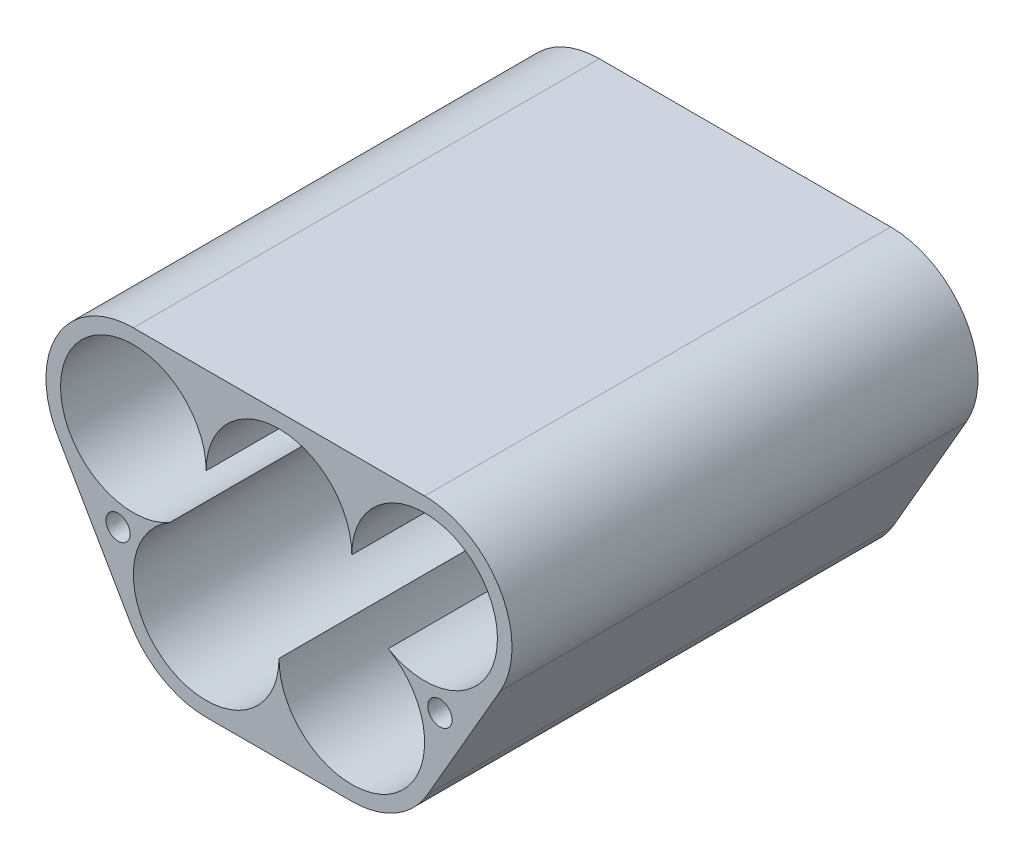
ISO-10303-21;
HEADER;
FILE_DESCRIPTION(('STEP AP214'),'2;1');
FILE_NAME('part.step','',(''),(''),'','','');
FILE_SCHEMA(('AUTOMOTIVE_DESIGN { 1 0 10303 214 1 1 1 1 }'));
ENDSEC;
DATA;
#1=APPLICATION_CONTEXT('core data for automotive mechanical design processes');
#2=APPLICATION_PROTOCOL_DEFINITION('international standard','automotive_design',2000,#1);
#3=PRODUCT_CONTEXT('',#1,'mechanical');
#4=PRODUCT('Part','Part','',(#3));
#5=PRODUCT_RELATED_PRODUCT_CATEGORY('part','',(#4));
#6=PRODUCT_DEFINITION_FORMATION('','',#4);
#7=PRODUCT_DEFINITION_CONTEXT('part definition',#1,'design');
#8=PRODUCT_DEFINITION('design','',#6,#7);
#9=PRODUCT_DEFINITION_SHAPE('','',#8);
#10=(LENGTH_UNIT() NAMED_UNIT(*) SI_UNIT(.MILLI.,.METRE.));
#11=(NAMED_UNIT(*) PLANE_ANGLE_UNIT() SI_UNIT($,.RADIAN.));
#12=(NAMED_UNIT(*) SI_UNIT($,.STERADIAN.) SOLID_ANGLE_UNIT());
#13=UNCERTAINTY_MEASURE_WITH_UNIT(LENGTH_MEASURE(1.E-05),#10,'distance_accuracy_value','');
#14=(GEOMETRIC_REPRESENTATION_CONTEXT(3) GLOBAL_UNCERTAINTY_ASSIGNED_CONTEXT((#13)) GLOBAL_UNIT_ASSIGNED_CONTEXT((#10,
#11,#12)) REPRESENTATION_CONTEXT('',''));
#15=CARTESIAN_POINT('',(0.,0.,0.));
#16=DIRECTION('',(0.,0.,1.));
#17=DIRECTION('',(1.,0.,0.));
#18=AXIS2_PLACEMENT_3D('',#15,#16,#17);
#19=CARTESIAN_POINT('',(7.5,-12.9903810567666,48.));
#20=DIRECTION('',(0.,0.,1.));
#21=DIRECTION('',(1.,0.,0.));
#22=AXIS2_PLACEMENT_3D('',#19,#20,#21);
#23=PLANE('',#22);
#24=CARTESIAN_POINT('',(31.5749810287862,-9.5701905283834,48.));
#25=DIRECTION('',(0.,0.,-1.));
#26=DIRECTION('',(-1.,0.,0.));
#27=AXIS2_PLACEMENT_3D('',#24,#25,#26);
#28=CIRCLE('',#27,1.24999999999999);
#29=CARTESIAN_POINT('',(30.3249810287862,-9.5701905283834,48.));
#30=VERTEX_POINT('',#29);
#31=EDGE_CURVE('E319',#30,#30,#28,.T.);
#32=ORIENTED_EDGE('',*,*,#31,.T.);
#33=EDGE_LOOP('',(#32));
#34=FACE_BOUND('',#33,.T.);
#35=CARTESIAN_POINT('',(-1.57605623327455,-9.5701905283834,48.));
#36=DIRECTION('',(0.,0.,-1.));
#37=DIRECTION('',(-1.,0.,0.));
#38=AXIS2_PLACEMENT_3D('',#35,#36,#37);
#39=CIRCLE('',#38,1.25);
#40=CARTESIAN_POINT('',(-2.82605623327455,-9.5701905283834,48.));
#41=VERTEX_POINT('',#40);
#42=EDGE_CURVE('E159',#41,#41,#39,.T.);
#43=ORIENTED_EDGE('',*,*,#42,.T.);
#44=EDGE_LOOP('',(#43));
#45=FACE_BOUND('',#44,.T.);
#46=CARTESIAN_POINT('',(7.5,-12.9903810567666,48.));
#47=DIRECTION('',(0.,0.,1.));
#48=DIRECTION('',(1.,0.,0.));
#49=AXIS2_PLACEMENT_3D('',#46,#47,#48);
#50=CIRCLE('',#49,9.);
#51=CARTESIAN_POINT('',(-0.294228634059947,-17.4903810567666,48.));
#52=VERTEX_POINT('',#51);
#53=CARTESIAN_POINT('',(7.4999999999999,-21.9903810567666,48.));
#54=VERTEX_POINT('',#53);
#55=EDGE_CURVE('E174',#52,#54,#50,.T.);
#56=ORIENTED_EDGE('',*,*,#55,.T.);
#57=DIRECTION('',(1.,0.,0.));
#58=VECTOR('',#57,1.);
#59=CARTESIAN_POINT('',(7.4999999999999,-21.9903810567666,48.));
#60=LINE('',#59,#58);
#61=CARTESIAN_POINT('',(22.4999999999999,-21.9903810567666,48.));
#62=VERTEX_POINT('',#61);
#63=EDGE_CURVE('E177',#54,#62,#60,.T.);
#64=ORIENTED_EDGE('',*,*,#63,.T.);
#65=CARTESIAN_POINT('',(22.5,-12.9903810567666,48.));
#66=DIRECTION('',(0.,0.,1.));
#67=DIRECTION('',(1.,0.,0.));
#68=AXIS2_PLACEMENT_3D('',#65,#66,#67);
#69=CIRCLE('',#68,9.);
#70=CARTESIAN_POINT('',(30.2942286340599,-17.4903810567666,48.));
#71=VERTEX_POINT('',#70);
#72=EDGE_CURVE('E180',#62,#71,#69,.T.);
#73=ORIENTED_EDGE('',*,*,#72,.T.);
#74=DIRECTION('',(0.5,0.866025403784438,0.));
#75=VECTOR('',#74,1.);
#76=CARTESIAN_POINT('',(30.2942286340599,-17.4903810567666,48.));
#77=LINE('',#76,#75);
#78=CARTESIAN_POINT('',(37.7942286340599,-4.5,48.));
#79=VERTEX_POINT('',#78);
#80=EDGE_CURVE('E182',#71,#79,#77,.T.);
#81=ORIENTED_EDGE('',*,*,#80,.T.);
#82=CARTESIAN_POINT('',(30.,0.,48.));
#83=DIRECTION('',(0.,0.,1.));
#84=DIRECTION('',(1.,0.,0.));
#85=AXIS2_PLACEMENT_3D('',#82,#83,#84);
#86=CIRCLE('',#85,9.00000000000001);
#87=CARTESIAN_POINT('',(30.,9.00000000000001,48.));
#88=VERTEX_POINT('',#87);
#89=EDGE_CURVE('E184',#79,#88,#86,.T.);
#90=ORIENTED_EDGE('',*,*,#89,.T.);
#91=DIRECTION('',(-1.,0.,0.));
#92=VECTOR('',#91,1.);
#93=CARTESIAN_POINT('',(30.,9.,48.));
#94=LINE('',#93,#92);
#95=CARTESIAN_POINT('',(0.,9.,48.));
#96=VERTEX_POINT('',#95);
#97=EDGE_CURVE('E186',#88,#96,#94,.T.);
#98=ORIENTED_EDGE('',*,*,#97,.T.);
#99=CARTESIAN_POINT('',(0.,0.,48.));
#100=DIRECTION('',(0.,0.,1.));
#101=DIRECTION('',(1.,0.,0.));
#102=AXIS2_PLACEMENT_3D('',#99,#100,#101);
#103=CIRCLE('',#102,9.);
#104=CARTESIAN_POINT('',(-7.79422863405995,-4.49999999999999,48.));
#105=VERTEX_POINT('',#104);
#106=EDGE_CURVE('E188',#96,#105,#103,.T.);
#107=ORIENTED_EDGE('',*,*,#106,.T.);
#108=DIRECTION('',(0.5,-0.866025403784439,0.));
#109=VECTOR('',#108,1.);
#110=CARTESIAN_POINT('',(-7.79422863405995,-4.5,48.));
#111=LINE('',#110,#109);
#112=EDGE_CURVE('E190',#105,#52,#111,.T.);
#113=ORIENTED_EDGE('',*,*,#112,.T.);
#114=EDGE_LOOP('',(#56,#64,#73,#81,#90,#98,#107,#113));
#115=FACE_BOUND('',#114,.T.);
#116=CARTESIAN_POINT('',(7.5,-12.9903810567666,48.));
#117=DIRECTION('',(0.,0.,1.));
#118=DIRECTION('',(1.,0.,0.));
#119=AXIS2_PLACEMENT_3D('',#116,#117,#118);
#120=CIRCLE('',#119,7.5);
#121=CARTESIAN_POINT('',(3.75,-6.49519052838329,48.));
#122=VERTEX_POINT('',#121);
#123=CARTESIAN_POINT('',(15.,-12.9903810567666,48.));
#124=VERTEX_POINT('',#123);
#125=EDGE_CURVE('E136',#122,#124,#120,.T.);
#126=ORIENTED_EDGE('',*,*,#125,.F.);
#127=CARTESIAN_POINT('',(0.,0.,48.));
#128=DIRECTION('',(0.,0.,1.));
#129=DIRECTION('',(1.,0.,0.));
#130=AXIS2_PLACEMENT_3D('',#127,#128,#129);
#131=CIRCLE('',#130,7.5);
#132=CARTESIAN_POINT('',(7.5,0.,48.));
#133=VERTEX_POINT('',#132);
#134=EDGE_CURVE('E128',#133,#122,#131,.T.);
#135=ORIENTED_EDGE('',*,*,#134,.F.);
#136=CARTESIAN_POINT('',(15.,0.,48.));
#137=DIRECTION('',(0.,0.,1.));
#138=DIRECTION('',(1.,0.,0.));
#139=AXIS2_PLACEMENT_3D('',#136,#137,#138);
#140=CIRCLE('',#139,7.5);
#141=CARTESIAN_POINT('',(22.5,0.,48.));
#142=VERTEX_POINT('',#141);
#143=EDGE_CURVE('E156',#142,#133,#140,.T.);
#144=ORIENTED_EDGE('',*,*,#143,.F.);
#145=CARTESIAN_POINT('',(30.,0.,48.));
#146=DIRECTION('',(0.,0.,1.));
#147=DIRECTION('',(1.,0.,0.));
#148=AXIS2_PLACEMENT_3D('',#145,#146,#147);
#149=CIRCLE('',#148,7.5);
#150=CARTESIAN_POINT('',(26.25,-6.49519052838329,48.));
#151=VERTEX_POINT('',#150);
#152=EDGE_CURVE('E151',#151,#142,#149,.T.);
#153=ORIENTED_EDGE('',*,*,#152,.F.);
#154=CARTESIAN_POINT('',(22.5,-12.9903810567666,48.));
#155=DIRECTION('',(0.,0.,1.));
#156=DIRECTION('',(1.,0.,0.));
#157=AXIS2_PLACEMENT_3D('',#154,#155,#156);
#158=CIRCLE('',#157,7.5);
#159=EDGE_CURVE('E149',#124,#151,#158,.T.);
#160=ORIENTED_EDGE('',*,*,#159,.F.);
#161=EDGE_LOOP('',(#126,#135,#144,#153,#160));
#162=FACE_BOUND('',#161,.T.);
#163=ADVANCED_FACE('F33',(#34,#45,#115,#162),#23,.T.);
#164=CARTESIAN_POINT('',(7.5,-12.9903810567666,0.));
#165=DIRECTION('',(0.,0.,1.));
#166=DIRECTION('',(1.,0.,0.));
#167=AXIS2_PLACEMENT_3D('',#164,#165,#166);
#168=PLANE('',#167);
#169=CARTESIAN_POINT('',(31.5749810287862,-9.5701905283834,0.));
#170=DIRECTION('',(0.,0.,-1.));
#171=DIRECTION('',(-1.,0.,0.));
#172=AXIS2_PLACEMENT_3D('',#169,#170,#171);
#173=CIRCLE('',#172,1.24999999999999);
#174=CARTESIAN_POINT('',(30.3249810287862,-9.5701905283834,0.));
#175=VERTEX_POINT('',#174);
#176=EDGE_CURVE('E322',#175,#175,#173,.T.);
#177=ORIENTED_EDGE('',*,*,#176,.F.);
#178=EDGE_LOOP('',(#177));
#179=FACE_BOUND('',#178,.T.);
#180=CARTESIAN_POINT('',(-1.57605623327455,-9.5701905283834,0.));
#181=DIRECTION('',(0.,0.,-1.));
#182=DIRECTION('',(-1.,0.,0.));
#183=AXIS2_PLACEMENT_3D('',#180,#181,#182);
#184=CIRCLE('',#183,1.25);
#185=CARTESIAN_POINT('',(-2.82605623327455,-9.5701905283834,0.));
#186=VERTEX_POINT('',#185);
#187=EDGE_CURVE('E324',#186,#186,#184,.T.);
#188=ORIENTED_EDGE('',*,*,#187,.F.);
#189=EDGE_LOOP('',(#188));
#190=FACE_BOUND('',#189,.T.);
#191=CARTESIAN_POINT('',(7.5,-12.9903810567666,0.));
#192=DIRECTION('',(0.,0.,1.));
#193=DIRECTION('',(1.,0.,0.));
#194=AXIS2_PLACEMENT_3D('',#191,#192,#193);
#195=CIRCLE('',#194,9.);
#196=CARTESIAN_POINT('',(-0.294228634059947,-17.4903810567666,0.));
#197=VERTEX_POINT('',#196);
#198=CARTESIAN_POINT('',(7.4999999999999,-21.9903810567666,0.));
#199=VERTEX_POINT('',#198);
#200=EDGE_CURVE('E144',#197,#199,#195,.T.);
#201=ORIENTED_EDGE('',*,*,#200,.F.);
#202=DIRECTION('',(0.5,-0.866025403784439,0.));
#203=VECTOR('',#202,1.);
#204=CARTESIAN_POINT('',(-7.79422863405995,-4.5,0.));
#205=LINE('',#204,#203);
#206=CARTESIAN_POINT('',(-7.79422863405995,-4.49999999999999,0.));
#207=VERTEX_POINT('',#206);
#208=EDGE_CURVE('E178',#207,#197,#205,.T.);
#209=ORIENTED_EDGE('',*,*,#208,.F.);
#210=CARTESIAN_POINT('',(0.,0.,0.));
#211=DIRECTION('',(0.,0.,1.));
#212=DIRECTION('',(1.,0.,0.));
#213=AXIS2_PLACEMENT_3D('',#210,#211,#212);
#214=CIRCLE('',#213,9.);
#215=CARTESIAN_POINT('',(0.,9.,0.));
#216=VERTEX_POINT('',#215);
#217=EDGE_CURVE('E205',#216,#207,#214,.T.);
#218=ORIENTED_EDGE('',*,*,#217,.F.);
#219=DIRECTION('',(-1.,0.,0.));
#220=VECTOR('',#219,1.);
#221=CARTESIAN_POINT('',(30.,9.,0.));
#222=LINE('',#221,#220);
#223=CARTESIAN_POINT('',(30.,9.00000000000001,0.));
#224=VERTEX_POINT('',#223);
#225=EDGE_CURVE('E203',#224,#216,#222,.T.);
#226=ORIENTED_EDGE('',*,*,#225,.F.);
#227=CARTESIAN_POINT('',(30.,0.,0.));
#228=DIRECTION('',(0.,0.,1.));
#229=DIRECTION('',(1.,0.,0.));
#230=AXIS2_PLACEMENT_3D('',#227,#228,#229);
#231=CIRCLE('',#230,9.00000000000001);
#232=CARTESIAN_POINT('',(37.7942286340599,-4.5,0.));
#233=VERTEX_POINT('',#232);
#234=EDGE_CURVE('E201',#233,#224,#231,.T.);
#235=ORIENTED_EDGE('',*,*,#234,.F.);
#236=DIRECTION('',(0.5,0.866025403784438,0.));
#237=VECTOR('',#236,1.);
#238=CARTESIAN_POINT('',(30.2942286340599,-17.4903810567666,0.));
#239=LINE('',#238,#237);
#240=CARTESIAN_POINT('',(30.2942286340599,-17.4903810567666,0.));
#241=VERTEX_POINT('',#240);
#242=EDGE_CURVE('E199',#241,#233,#239,.T.);
#243=ORIENTED_EDGE('',*,*,#242,.F.);
#244=CARTESIAN_POINT('',(22.5,-12.9903810567666,0.));
#245=DIRECTION('',(0.,0.,1.));
#246=DIRECTION('',(1.,0.,0.));
#247=AXIS2_PLACEMENT_3D('',#244,#245,#246);
#248=CIRCLE('',#247,9.);
#249=CARTESIAN_POINT('',(22.4999999999999,-21.9903810567666,0.));
#250=VERTEX_POINT('',#249);
#251=EDGE_CURVE('E197',#250,#241,#248,.T.);
#252=ORIENTED_EDGE('',*,*,#251,.F.);
#253=DIRECTION('',(1.,0.,0.));
#254=VECTOR('',#253,1.);
#255=CARTESIAN_POINT('',(7.4999999999999,-21.9903810567666,0.));
#256=LINE('',#255,#254);
#257=EDGE_CURVE('E195',#199,#250,#256,.T.);
#258=ORIENTED_EDGE('',*,*,#257,.F.);
#259=EDGE_LOOP('',(#201,#209,#218,#226,#235,#243,#252,#258));
#260=FACE_BOUND('',#259,.T.);
#261=CARTESIAN_POINT('',(0.,0.,0.));
#262=DIRECTION('',(0.,0.,1.));
#263=DIRECTION('',(1.,0.,0.));
#264=AXIS2_PLACEMENT_3D('',#261,#262,#263);
#265=CIRCLE('',#264,7.5);
#266=CARTESIAN_POINT('',(7.5,0.,0.));
#267=VERTEX_POINT('',#266);
#268=CARTESIAN_POINT('',(3.75,-6.49519052838329,0.));
#269=VERTEX_POINT('',#268);
#270=EDGE_CURVE('E56',#267,#269,#265,.T.);
#271=ORIENTED_EDGE('',*,*,#270,.T.);
#272=CARTESIAN_POINT('',(7.5,-12.9903810567666,0.));
#273=DIRECTION('',(0.,0.,1.));
#274=DIRECTION('',(1.,0.,0.));
#275=AXIS2_PLACEMENT_3D('',#272,#273,#274);
#276=CIRCLE('',#275,7.5);
#277=CARTESIAN_POINT('',(15.,-12.9903810567666,0.));
#278=VERTEX_POINT('',#277);
#279=EDGE_CURVE('E143',#269,#278,#276,.T.);
#280=ORIENTED_EDGE('',*,*,#279,.T.);
#281=CARTESIAN_POINT('',(22.5,-12.9903810567666,0.));
#282=DIRECTION('',(0.,0.,1.));
#283=DIRECTION('',(1.,0.,0.));
#284=AXIS2_PLACEMENT_3D('',#281,#282,#283);
#285=CIRCLE('',#284,7.5);
#286=CARTESIAN_POINT('',(26.25,-6.49519052838329,0.));
#287=VERTEX_POINT('',#286);
#288=EDGE_CURVE('E161',#278,#287,#285,.T.);
#289=ORIENTED_EDGE('',*,*,#288,.T.);
#290=CARTESIAN_POINT('',(30.,0.,0.));
#291=DIRECTION('',(0.,0.,1.));
#292=DIRECTION('',(1.,0.,0.));
#293=AXIS2_PLACEMENT_3D('',#290,#291,#292);
#294=CIRCLE('',#293,7.5);
#295=CARTESIAN_POINT('',(22.5,0.,0.));
#296=VERTEX_POINT('',#295);
#297=EDGE_CURVE('E164',#287,#296,#294,.T.);
#298=ORIENTED_EDGE('',*,*,#297,.T.);
#299=CARTESIAN_POINT('',(15.,0.,0.));
#300=DIRECTION('',(0.,0.,1.));
#301=DIRECTION('',(1.,0.,0.));
#302=AXIS2_PLACEMENT_3D('',#299,#300,#301);
#303=CIRCLE('',#302,7.5);
#304=EDGE_CURVE('E137',#296,#267,#303,.T.);
#305=ORIENTED_EDGE('',*,*,#304,.T.);
#306=EDGE_LOOP('',(#271,#280,#289,#298,#305));
#307=FACE_BOUND('',#306,.T.);
#308=ADVANCED_FACE('F235',(#179,#190,#260,#307),#168,.F.);
#309=CARTESIAN_POINT('',(7.5,-12.9903810567666,48.));
#310=DIRECTION('',(0.,0.,-1.));
#311=DIRECTION('',(-1.,0.,0.));
#312=AXIS2_PLACEMENT_3D('',#309,#310,#311);
#313=CYLINDRICAL_SURFACE('',#312,9.);
#314=ORIENTED_EDGE('',*,*,#200,.T.);
#315=DIRECTION('',(0.,0.,-1.));
#316=VECTOR('',#315,1.);
#317=CARTESIAN_POINT('',(7.4999999999999,-21.9903810567666,48.));
#318=LINE('',#317,#316);
#319=EDGE_CURVE('E11',#54,#199,#318,.T.);
#320=ORIENTED_EDGE('',*,*,#319,.F.);
#321=ORIENTED_EDGE('',*,*,#55,.F.);
#322=DIRECTION('',(0.,0.,-1.));
#323=VECTOR('',#322,1.);
#324=CARTESIAN_POINT('',(-0.294228634059947,-17.4903810567666,48.));
#325=LINE('',#324,#323);
#326=EDGE_CURVE('E192',#52,#197,#325,.T.);
#327=ORIENTED_EDGE('',*,*,#326,.T.);
#328=EDGE_LOOP('',(#314,#320,#321,#327));
#329=FACE_BOUND('',#328,.T.);
#330=ADVANCED_FACE('F35',(#329),#313,.T.);
#331=CARTESIAN_POINT('',(7.4999999999999,-21.9903810567666,48.));
#332=DIRECTION('',(0.,1.,0.));
#333=DIRECTION('',(-1.,0.,0.));
#334=AXIS2_PLACEMENT_3D('',#331,#332,#333);
#335=PLANE('',#334);
#336=ORIENTED_EDGE('',*,*,#257,.T.);
#337=DIRECTION('',(0.,0.,-1.));
#338=VECTOR('',#337,1.);
#339=CARTESIAN_POINT('',(22.4999999999999,-21.9903810567666,48.));
#340=LINE('',#339,#338);
#341=EDGE_CURVE('E41',#62,#250,#340,.T.);
#342=ORIENTED_EDGE('',*,*,#341,.F.);
#343=ORIENTED_EDGE('',*,*,#63,.F.);
#344=ORIENTED_EDGE('',*,*,#319,.T.);
#345=EDGE_LOOP('',(#336,#342,#343,#344));
#346=FACE_BOUND('',#345,.T.);
#347=ADVANCED_FACE('F252',(#346),#335,.F.);
#348=CARTESIAN_POINT('',(22.5,-12.9903810567666,48.));
#349=DIRECTION('',(0.,0.,-1.));
#350=DIRECTION('',(-1.,0.,0.));
#351=AXIS2_PLACEMENT_3D('',#348,#349,#350);
#352=CYLINDRICAL_SURFACE('',#351,9.);
#353=ORIENTED_EDGE('',*,*,#251,.T.);
#354=DIRECTION('',(0.,0.,-1.));
#355=VECTOR('',#354,1.);
#356=CARTESIAN_POINT('',(30.2942286340599,-17.4903810567666,48.));
#357=LINE('',#356,#355);
#358=EDGE_CURVE('E222',#71,#241,#357,.T.);
#359=ORIENTED_EDGE('',*,*,#358,.F.);
#360=ORIENTED_EDGE('',*,*,#72,.F.);
#361=ORIENTED_EDGE('',*,*,#341,.T.);
#362=EDGE_LOOP('',(#353,#359,#360,#361));
#363=FACE_BOUND('',#362,.T.);
#364=ADVANCED_FACE('F229',(#363),#352,.T.);
#365=CARTESIAN_POINT('',(30.2942286340599,-17.4903810567666,48.));
#366=DIRECTION('',(-0.866025403784438,0.5,0.));
#367=DIRECTION('',(-0.5,-0.866025403784438,0.));
#368=AXIS2_PLACEMENT_3D('',#365,#366,#367);
#369=PLANE('',#368);
#370=ORIENTED_EDGE('',*,*,#242,.T.);
#371=DIRECTION('',(0.,0.,-1.));
#372=VECTOR('',#371,1.);
#373=CARTESIAN_POINT('',(37.7942286340599,-4.5,48.));
#374=LINE('',#373,#372);
#375=EDGE_CURVE('E219',#79,#233,#374,.T.);
#376=ORIENTED_EDGE('',*,*,#375,.F.);
#377=ORIENTED_EDGE('',*,*,#80,.F.);
#378=ORIENTED_EDGE('',*,*,#358,.T.);
#379=EDGE_LOOP('',(#370,#376,#377,#378));
#380=FACE_BOUND('',#379,.T.);
#381=ADVANCED_FACE('F241',(#380),#369,.F.);
#382=CARTESIAN_POINT('',(30.,0.,48.));
#383=DIRECTION('',(0.,0.,-1.));
#384=DIRECTION('',(-1.,0.,0.));
#385=AXIS2_PLACEMENT_3D('',#382,#383,#384);
#386=CYLINDRICAL_SURFACE('',#385,9.00000000000001);
#387=ORIENTED_EDGE('',*,*,#234,.T.);
#388=DIRECTION('',(0.,0.,-1.));
#389=VECTOR('',#388,1.);
#390=CARTESIAN_POINT('',(30.,9.00000000000001,48.));
#391=LINE('',#390,#389);
#392=EDGE_CURVE('E216',#88,#224,#391,.T.);
#393=ORIENTED_EDGE('',*,*,#392,.F.);
#394=ORIENTED_EDGE('',*,*,#89,.F.);
#395=ORIENTED_EDGE('',*,*,#375,.T.);
#396=EDGE_LOOP('',(#387,#393,#394,#395));
#397=FACE_BOUND('',#396,.T.);
#398=ADVANCED_FACE('F245',(#397),#386,.T.);
#399=CARTESIAN_POINT('',(30.,9.,48.));
#400=DIRECTION('',(0.,-1.,0.));
#401=DIRECTION('',(1.,0.,0.));
#402=AXIS2_PLACEMENT_3D('',#399,#400,#401);
#403=PLANE('',#402);
#404=ORIENTED_EDGE('',*,*,#225,.T.);
#405=DIRECTION('',(0.,0.,-1.));
#406=VECTOR('',#405,1.);
#407=CARTESIAN_POINT('',(0.,9.,48.));
#408=LINE('',#407,#406);
#409=EDGE_CURVE('E213',#96,#216,#408,.T.);
#410=ORIENTED_EDGE('',*,*,#409,.F.);
#411=ORIENTED_EDGE('',*,*,#97,.F.);
#412=ORIENTED_EDGE('',*,*,#392,.T.);
#413=EDGE_LOOP('',(#404,#410,#411,#412));
#414=FACE_BOUND('',#413,.T.);
#415=ADVANCED_FACE('F265',(#414),#403,.F.);
#416=CARTESIAN_POINT('',(0.,0.,48.));
#417=DIRECTION('',(0.,0.,-1.));
#418=DIRECTION('',(-1.,0.,0.));
#419=AXIS2_PLACEMENT_3D('',#416,#417,#418);
#420=CYLINDRICAL_SURFACE('',#419,9.);
#421=ORIENTED_EDGE('',*,*,#217,.T.);
#422=DIRECTION('',(0.,0.,-1.));
#423=VECTOR('',#422,1.);
#424=CARTESIAN_POINT('',(-7.79422863405995,-4.49999999999999,48.));
#425=LINE('',#424,#423);
#426=EDGE_CURVE('E210',#105,#207,#425,.T.);
#427=ORIENTED_EDGE('',*,*,#426,.F.);
#428=ORIENTED_EDGE('',*,*,#106,.F.);
#429=ORIENTED_EDGE('',*,*,#409,.T.);
#430=EDGE_LOOP('',(#421,#427,#428,#429));
#431=FACE_BOUND('',#430,.T.);
#432=ADVANCED_FACE('F263',(#431),#420,.T.);
#433=CARTESIAN_POINT('',(-7.79422863405995,-4.5,48.));
#434=DIRECTION('',(0.866025403784439,0.5,0.));
#435=DIRECTION('',(-0.5,0.866025403784439,0.));
#436=AXIS2_PLACEMENT_3D('',#433,#434,#435);
#437=PLANE('',#436);
#438=ORIENTED_EDGE('',*,*,#208,.T.);
#439=ORIENTED_EDGE('',*,*,#326,.F.);
#440=ORIENTED_EDGE('',*,*,#112,.F.);
#441=ORIENTED_EDGE('',*,*,#426,.T.);
#442=EDGE_LOOP('',(#438,#439,#440,#441));
#443=FACE_BOUND('',#442,.T.);
#444=ADVANCED_FACE('F258',(#443),#437,.F.);
#445=CARTESIAN_POINT('',(0.,0.,48.));
#446=DIRECTION('',(0.,0.,-1.));
#447=DIRECTION('',(-1.,0.,0.));
#448=AXIS2_PLACEMENT_3D('',#445,#446,#447);
#449=CYLINDRICAL_SURFACE('',#448,7.5);
#450=ORIENTED_EDGE('',*,*,#270,.F.);
#451=DIRECTION('',(0.,0.,-1.));
#452=VECTOR('',#451,1.);
#453=CARTESIAN_POINT('',(7.5,0.,48.));
#454=LINE('',#453,#452);
#455=EDGE_CURVE('E132',#133,#267,#454,.T.);
#456=ORIENTED_EDGE('',*,*,#455,.F.);
#457=ORIENTED_EDGE('',*,*,#134,.T.);
#458=DIRECTION('',(0.,0.,-1.));
#459=VECTOR('',#458,1.);
#460=CARTESIAN_POINT('',(3.75,-6.49519052838329,48.));
#461=LINE('',#460,#459);
#462=EDGE_CURVE('E131',#122,#269,#461,.T.);
#463=ORIENTED_EDGE('',*,*,#462,.T.);
#464=EDGE_LOOP('',(#450,#456,#457,#463));
#465=FACE_BOUND('',#464,.T.);
#466=ADVANCED_FACE('F130',(#465),#449,.F.);
#467=CARTESIAN_POINT('',(7.5,-12.9903810567666,48.));
#468=DIRECTION('',(0.,0.,-1.));
#469=DIRECTION('',(-1.,0.,0.));
#470=AXIS2_PLACEMENT_3D('',#467,#468,#469);
#471=CYLINDRICAL_SURFACE('',#470,7.5);
#472=ORIENTED_EDGE('',*,*,#279,.F.);
#473=ORIENTED_EDGE('',*,*,#462,.F.);
#474=ORIENTED_EDGE('',*,*,#125,.T.);
#475=DIRECTION('',(0.,0.,-1.));
#476=VECTOR('',#475,1.);
#477=CARTESIAN_POINT('',(15.,-12.9903810567666,48.));
#478=LINE('',#477,#476);
#479=EDGE_CURVE('E145',#124,#278,#478,.T.);
#480=ORIENTED_EDGE('',*,*,#479,.T.);
#481=EDGE_LOOP('',(#472,#473,#474,#480));
#482=FACE_BOUND('',#481,.T.);
#483=ADVANCED_FACE('F140',(#482),#471,.F.);
#484=CARTESIAN_POINT('',(22.5,-12.9903810567666,48.));
#485=DIRECTION('',(0.,0.,-1.));
#486=DIRECTION('',(-1.,0.,0.));
#487=AXIS2_PLACEMENT_3D('',#484,#485,#486);
#488=CYLINDRICAL_SURFACE('',#487,7.5);
#489=ORIENTED_EDGE('',*,*,#288,.F.);
#490=ORIENTED_EDGE('',*,*,#479,.F.);
#491=ORIENTED_EDGE('',*,*,#159,.T.);
#492=DIRECTION('',(0.,0.,-1.));
#493=VECTOR('',#492,1.);
#494=CARTESIAN_POINT('',(26.25,-6.49519052838329,48.));
#495=LINE('',#494,#493);
#496=EDGE_CURVE('E171',#151,#287,#495,.T.);
#497=ORIENTED_EDGE('',*,*,#496,.T.);
#498=EDGE_LOOP('',(#489,#490,#491,#497));
#499=FACE_BOUND('',#498,.T.);
#500=ADVANCED_FACE('F294',(#499),#488,.F.);
#501=CARTESIAN_POINT('',(30.,0.,48.));
#502=DIRECTION('',(0.,0.,-1.));
#503=DIRECTION('',(-1.,0.,0.));
#504=AXIS2_PLACEMENT_3D('',#501,#502,#503);
#505=CYLINDRICAL_SURFACE('',#504,7.5);
#506=ORIENTED_EDGE('',*,*,#297,.F.);
#507=ORIENTED_EDGE('',*,*,#496,.F.);
#508=ORIENTED_EDGE('',*,*,#152,.T.);
#509=DIRECTION('',(0.,0.,-1.));
#510=VECTOR('',#509,1.);
#511=CARTESIAN_POINT('',(22.5,0.,48.));
#512=LINE('',#511,#510);
#513=EDGE_CURVE('E48',#142,#296,#512,.T.);
#514=ORIENTED_EDGE('',*,*,#513,.T.);
#515=EDGE_LOOP('',(#506,#507,#508,#514));
#516=FACE_BOUND('',#515,.T.);
#517=ADVANCED_FACE('F298',(#516),#505,.F.);
#518=CARTESIAN_POINT('',(15.,0.,48.));
#519=DIRECTION('',(0.,0.,-1.));
#520=DIRECTION('',(-1.,0.,0.));
#521=AXIS2_PLACEMENT_3D('',#518,#519,#520);
#522=CYLINDRICAL_SURFACE('',#521,7.5);
#523=ORIENTED_EDGE('',*,*,#304,.F.);
#524=ORIENTED_EDGE('',*,*,#513,.F.);
#525=ORIENTED_EDGE('',*,*,#143,.T.);
#526=ORIENTED_EDGE('',*,*,#455,.T.);
#527=EDGE_LOOP('',(#523,#524,#525,#526));
#528=FACE_BOUND('',#527,.T.);
#529=ADVANCED_FACE('F304',(#528),#522,.F.);
#530=CARTESIAN_POINT('',(-1.57605623327455,-9.5701905283834,48.));
#531=DIRECTION('',(0.,0.,-1.));
#532=DIRECTION('',(-1.,0.,0.));
#533=AXIS2_PLACEMENT_3D('',#530,#531,#532);
#534=CYLINDRICAL_SURFACE('',#533,1.25);
#535=ORIENTED_EDGE('',*,*,#42,.F.);
#536=EDGE_LOOP('',(#535));
#537=FACE_BOUND('',#536,.T.);
#538=ORIENTED_EDGE('',*,*,#187,.T.);
#539=EDGE_LOOP('',(#538));
#540=FACE_BOUND('',#539,.T.);
#541=ADVANCED_FACE('F308',(#537,#540),#534,.F.);
#542=CARTESIAN_POINT('',(31.5749810287862,-9.5701905283834,48.));
#543=DIRECTION('',(0.,0.,-1.));
#544=DIRECTION('',(-1.,0.,0.));
#545=AXIS2_PLACEMENT_3D('',#542,#543,#544);
#546=CYLINDRICAL_SURFACE('',#545,1.24999999999999);
#547=ORIENTED_EDGE('',*,*,#31,.F.);
#548=EDGE_LOOP('',(#547));
#549=FACE_BOUND('',#548,.T.);
#550=ORIENTED_EDGE('',*,*,#176,.T.);
#551=EDGE_LOOP('',(#550));
#552=FACE_BOUND('',#551,.T.);
#553=ADVANCED_FACE('F311',(#549,#552),#546,.F.);
#554=CLOSED_SHELL('',(#163,#308,#330,#347,#364,#381,#398,#415,#432,#444,#466,#483,#500,#517,
#529,#541,#553));
#555=MANIFOLD_SOLID_BREP('B2',#554);
#556=ADVANCED_BREP_SHAPE_REPRESENTATION('',(#18,#555),#14);
#557=SHAPE_DEFINITION_REPRESENTATION(#9,#556);
ENDSEC;
END-ISO-10303-21;
